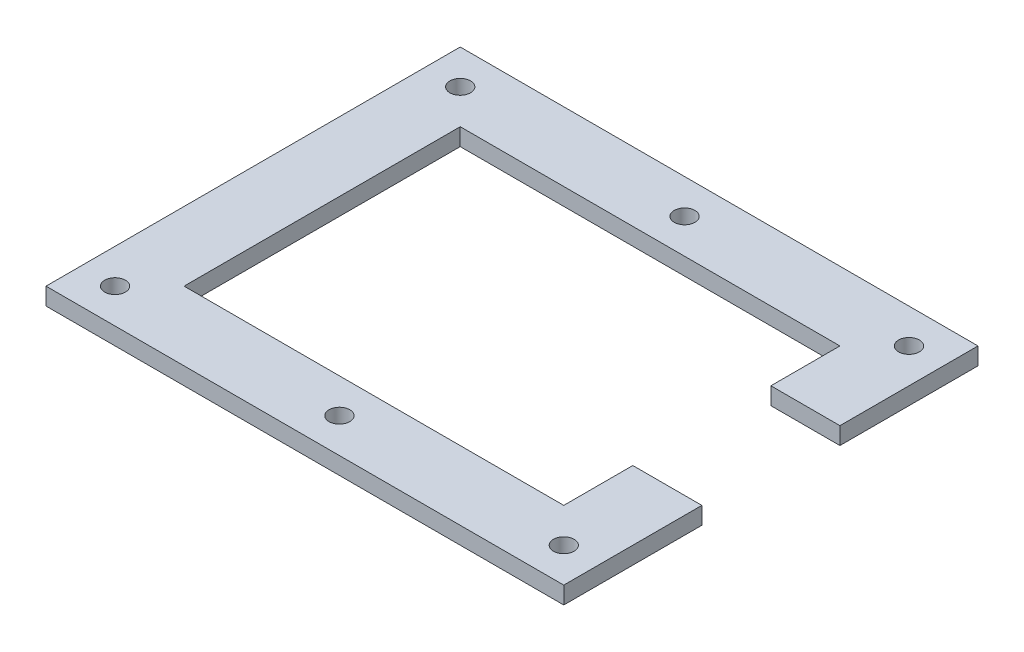
ISO-10303-21;
HEADER;
FILE_DESCRIPTION(('STEP AP214'),'2;1');
FILE_NAME('part.step','',(''),(''),'','','');
FILE_SCHEMA(('AUTOMOTIVE_DESIGN { 1 0 10303 214 1 1 1 1 }'));
ENDSEC;
DATA;
#1=APPLICATION_CONTEXT('core data for automotive mechanical design processes');
#2=APPLICATION_PROTOCOL_DEFINITION('international standard','automotive_design',2000,#1);
#3=PRODUCT_CONTEXT('',#1,'mechanical');
#4=PRODUCT('Part','Part','',(#3));
#5=PRODUCT_RELATED_PRODUCT_CATEGORY('part','',(#4));
#6=PRODUCT_DEFINITION_FORMATION('','',#4);
#7=PRODUCT_DEFINITION_CONTEXT('part definition',#1,'design');
#8=PRODUCT_DEFINITION('design','',#6,#7);
#9=PRODUCT_DEFINITION_SHAPE('','',#8);
#10=(LENGTH_UNIT() NAMED_UNIT(*) SI_UNIT(.MILLI.,.METRE.));
#11=(NAMED_UNIT(*) PLANE_ANGLE_UNIT() SI_UNIT($,.RADIAN.));
#12=(NAMED_UNIT(*) SI_UNIT($,.STERADIAN.) SOLID_ANGLE_UNIT());
#13=UNCERTAINTY_MEASURE_WITH_UNIT(LENGTH_MEASURE(1.E-05),#10,'distance_accuracy_value','');
#14=(GEOMETRIC_REPRESENTATION_CONTEXT(3) GLOBAL_UNCERTAINTY_ASSIGNED_CONTEXT((#13)) GLOBAL_UNIT_ASSIGNED_CONTEXT((#10,
#11,#12)) REPRESENTATION_CONTEXT('',''));
#15=CARTESIAN_POINT('',(0.,0.,0.));
#16=DIRECTION('',(0.,0.,1.));
#17=DIRECTION('',(1.,0.,0.));
#18=AXIS2_PLACEMENT_3D('',#15,#16,#17);
#19=CARTESIAN_POINT('',(75.,2.5,-30.));
#20=DIRECTION('',(-1.,0.,0.));
#21=DIRECTION('',(0.,0.,1.));
#22=AXIS2_PLACEMENT_3D('',#19,#20,#21);
#23=PLANE('',#22);
#24=DIRECTION('',(0.,0.,-1.));
#25=VECTOR('',#24,1.);
#26=CARTESIAN_POINT('',(75.,0.,-30.));
#27=LINE('',#26,#25);
#28=CARTESIAN_POINT('',(75.,0.,-10.));
#29=VERTEX_POINT('',#28);
#30=CARTESIAN_POINT('',(75.,0.,-30.));
#31=VERTEX_POINT('',#30);
#32=EDGE_CURVE('E154',#29,#31,#27,.T.);
#33=ORIENTED_EDGE('',*,*,#32,.T.);
#34=DIRECTION('',(0.,-1.,0.));
#35=VECTOR('',#34,1.);
#36=CARTESIAN_POINT('',(75.,2.5,-30.));
#37=LINE('',#36,#35);
#38=CARTESIAN_POINT('',(75.,2.5,-30.));
#39=VERTEX_POINT('',#38);
#40=EDGE_CURVE('E11',#39,#31,#37,.T.);
#41=ORIENTED_EDGE('',*,*,#40,.F.);
#42=DIRECTION('',(0.,0.,-1.));
#43=VECTOR('',#42,1.);
#44=CARTESIAN_POINT('',(75.,2.5,-30.));
#45=LINE('',#44,#43);
#46=CARTESIAN_POINT('',(75.,2.5,-10.));
#47=VERTEX_POINT('',#46);
#48=EDGE_CURVE('E177',#47,#39,#45,.T.);
#49=ORIENTED_EDGE('',*,*,#48,.F.);
#50=DIRECTION('',(0.,-1.,0.));
#51=VECTOR('',#50,1.);
#52=CARTESIAN_POINT('',(75.,2.5,-10.));
#53=LINE('',#52,#51);
#54=EDGE_CURVE('E150',#47,#29,#53,.T.);
#55=ORIENTED_EDGE('',*,*,#54,.T.);
#56=EDGE_LOOP('',(#33,#41,#49,#55));
#57=FACE_BOUND('',#56,.T.);
#58=ADVANCED_FACE('F34',(#57),#23,.F.);
#59=CARTESIAN_POINT('',(0.,2.5,-30.));
#60=DIRECTION('',(0.,0.,1.));
#61=DIRECTION('',(1.,0.,0.));
#62=AXIS2_PLACEMENT_3D('',#59,#60,#61);
#63=PLANE('',#62);
#64=DIRECTION('',(-1.,0.,0.));
#65=VECTOR('',#64,1.);
#66=CARTESIAN_POINT('',(0.,0.,-30.));
#67=LINE('',#66,#65);
#68=CARTESIAN_POINT('',(0.,0.,-30.));
#69=VERTEX_POINT('',#68);
#70=EDGE_CURVE('E157',#31,#69,#67,.T.);
#71=ORIENTED_EDGE('',*,*,#70,.T.);
#72=DIRECTION('',(0.,-1.,0.));
#73=VECTOR('',#72,1.);
#74=CARTESIAN_POINT('',(0.,2.5,-30.));
#75=LINE('',#74,#73);
#76=CARTESIAN_POINT('',(0.,2.5,-30.));
#77=VERTEX_POINT('',#76);
#78=EDGE_CURVE('E42',#77,#69,#75,.T.);
#79=ORIENTED_EDGE('',*,*,#78,.F.);
#80=DIRECTION('',(-1.,0.,0.));
#81=VECTOR('',#80,1.);
#82=CARTESIAN_POINT('',(0.,2.5,-30.));
#83=LINE('',#82,#81);
#84=EDGE_CURVE('E105',#39,#77,#83,.T.);
#85=ORIENTED_EDGE('',*,*,#84,.F.);
#86=ORIENTED_EDGE('',*,*,#40,.T.);
#87=EDGE_LOOP('',(#71,#79,#85,#86));
#88=FACE_BOUND('',#87,.T.);
#89=ADVANCED_FACE('F256',(#88),#63,.F.);
#90=CARTESIAN_POINT('',(0.,2.5,30.));
#91=DIRECTION('',(1.,0.,0.));
#92=DIRECTION('',(0.,0.,-1.));
#93=AXIS2_PLACEMENT_3D('',#90,#91,#92);
#94=PLANE('',#93);
#95=DIRECTION('',(0.,0.,1.));
#96=VECTOR('',#95,1.);
#97=CARTESIAN_POINT('',(0.,0.,30.));
#98=LINE('',#97,#96);
#99=CARTESIAN_POINT('',(0.,0.,30.));
#100=VERTEX_POINT('',#99);
#101=EDGE_CURVE('E160',#69,#100,#98,.T.);
#102=ORIENTED_EDGE('',*,*,#101,.T.);
#103=DIRECTION('',(0.,-1.,0.));
#104=VECTOR('',#103,1.);
#105=CARTESIAN_POINT('',(0.,2.5,30.));
#106=LINE('',#105,#104);
#107=CARTESIAN_POINT('',(0.,2.5,30.));
#108=VERTEX_POINT('',#107);
#109=EDGE_CURVE('E196',#108,#100,#106,.T.);
#110=ORIENTED_EDGE('',*,*,#109,.F.);
#111=DIRECTION('',(0.,0.,1.));
#112=VECTOR('',#111,1.);
#113=CARTESIAN_POINT('',(0.,2.5,30.));
#114=LINE('',#113,#112);
#115=EDGE_CURVE('E204',#77,#108,#114,.T.);
#116=ORIENTED_EDGE('',*,*,#115,.F.);
#117=ORIENTED_EDGE('',*,*,#78,.T.);
#118=EDGE_LOOP('',(#102,#110,#116,#117));
#119=FACE_BOUND('',#118,.T.);
#120=ADVANCED_FACE('F202',(#119),#94,.F.);
#121=CARTESIAN_POINT('',(75.,2.5,30.));
#122=DIRECTION('',(0.,0.,-1.));
#123=DIRECTION('',(-1.,0.,0.));
#124=AXIS2_PLACEMENT_3D('',#121,#122,#123);
#125=PLANE('',#124);
#126=DIRECTION('',(1.,0.,0.));
#127=VECTOR('',#126,1.);
#128=CARTESIAN_POINT('',(75.,0.,30.));
#129=LINE('',#128,#127);
#130=CARTESIAN_POINT('',(75.,0.,30.));
#131=VERTEX_POINT('',#130);
#132=EDGE_CURVE('E162',#100,#131,#129,.T.);
#133=ORIENTED_EDGE('',*,*,#132,.T.);
#134=DIRECTION('',(0.,-1.,0.));
#135=VECTOR('',#134,1.);
#136=CARTESIAN_POINT('',(75.,2.5,30.));
#137=LINE('',#136,#135);
#138=CARTESIAN_POINT('',(75.,2.5,30.));
#139=VERTEX_POINT('',#138);
#140=EDGE_CURVE('E193',#139,#131,#137,.T.);
#141=ORIENTED_EDGE('',*,*,#140,.F.);
#142=DIRECTION('',(1.,0.,0.));
#143=VECTOR('',#142,1.);
#144=CARTESIAN_POINT('',(75.,2.5,30.));
#145=LINE('',#144,#143);
#146=EDGE_CURVE('E222',#108,#139,#145,.T.);
#147=ORIENTED_EDGE('',*,*,#146,.F.);
#148=ORIENTED_EDGE('',*,*,#109,.T.);
#149=EDGE_LOOP('',(#133,#141,#147,#148));
#150=FACE_BOUND('',#149,.T.);
#151=ADVANCED_FACE('F213',(#150),#125,.F.);
#152=CARTESIAN_POINT('',(75.,2.5,9.99999999999999));
#153=DIRECTION('',(-1.,0.,0.));
#154=DIRECTION('',(0.,0.,1.));
#155=AXIS2_PLACEMENT_3D('',#152,#153,#154);
#156=PLANE('',#155);
#157=DIRECTION('',(0.,0.,-1.));
#158=VECTOR('',#157,1.);
#159=CARTESIAN_POINT('',(75.,0.,9.99999999999999));
#160=LINE('',#159,#158);
#161=CARTESIAN_POINT('',(75.,0.,9.99999999999999));
#162=VERTEX_POINT('',#161);
#163=EDGE_CURVE('E164',#131,#162,#160,.T.);
#164=ORIENTED_EDGE('',*,*,#163,.T.);
#165=DIRECTION('',(0.,-1.,0.));
#166=VECTOR('',#165,1.);
#167=CARTESIAN_POINT('',(75.,2.5,9.99999999999999));
#168=LINE('',#167,#166);
#169=CARTESIAN_POINT('',(75.,2.5,9.99999999999999));
#170=VERTEX_POINT('',#169);
#171=EDGE_CURVE('E190',#170,#162,#168,.T.);
#172=ORIENTED_EDGE('',*,*,#171,.F.);
#173=DIRECTION('',(0.,0.,-1.));
#174=VECTOR('',#173,1.);
#175=CARTESIAN_POINT('',(75.,2.5,9.99999999999999));
#176=LINE('',#175,#174);
#177=EDGE_CURVE('E219',#139,#170,#176,.T.);
#178=ORIENTED_EDGE('',*,*,#177,.F.);
#179=ORIENTED_EDGE('',*,*,#140,.T.);
#180=EDGE_LOOP('',(#164,#172,#178,#179));
#181=FACE_BOUND('',#180,.T.);
#182=ADVANCED_FACE('F217',(#181),#156,.F.);
#183=CARTESIAN_POINT('',(65.,2.5,10.));
#184=DIRECTION('',(0.,0.,1.));
#185=DIRECTION('',(1.,0.,0.));
#186=AXIS2_PLACEMENT_3D('',#183,#184,#185);
#187=PLANE('',#186);
#188=DIRECTION('',(-1.,0.,0.));
#189=VECTOR('',#188,1.);
#190=CARTESIAN_POINT('',(65.,0.,10.));
#191=LINE('',#190,#189);
#192=CARTESIAN_POINT('',(65.,0.,10.));
#193=VERTEX_POINT('',#192);
#194=EDGE_CURVE('E166',#162,#193,#191,.T.);
#195=ORIENTED_EDGE('',*,*,#194,.T.);
#196=DIRECTION('',(0.,-1.,0.));
#197=VECTOR('',#196,1.);
#198=CARTESIAN_POINT('',(65.,2.5,10.));
#199=LINE('',#198,#197);
#200=CARTESIAN_POINT('',(65.,2.5,10.));
#201=VERTEX_POINT('',#200);
#202=EDGE_CURVE('E187',#201,#193,#199,.T.);
#203=ORIENTED_EDGE('',*,*,#202,.F.);
#204=DIRECTION('',(-1.,0.,0.));
#205=VECTOR('',#204,1.);
#206=CARTESIAN_POINT('',(65.,2.5,10.));
#207=LINE('',#206,#205);
#208=EDGE_CURVE('E221',#170,#201,#207,.T.);
#209=ORIENTED_EDGE('',*,*,#208,.F.);
#210=ORIENTED_EDGE('',*,*,#171,.T.);
#211=EDGE_LOOP('',(#195,#203,#209,#210));
#212=FACE_BOUND('',#211,.T.);
#213=ADVANCED_FACE('F269',(#212),#187,.F.);
#214=CARTESIAN_POINT('',(65.,2.5,20.));
#215=DIRECTION('',(1.,0.,0.));
#216=DIRECTION('',(0.,0.,-1.));
#217=AXIS2_PLACEMENT_3D('',#214,#215,#216);
#218=PLANE('',#217);
#219=DIRECTION('',(0.,0.,1.));
#220=VECTOR('',#219,1.);
#221=CARTESIAN_POINT('',(65.,0.,20.));
#222=LINE('',#221,#220);
#223=CARTESIAN_POINT('',(65.,0.,20.));
#224=VERTEX_POINT('',#223);
#225=EDGE_CURVE('E168',#193,#224,#222,.T.);
#226=ORIENTED_EDGE('',*,*,#225,.T.);
#227=DIRECTION('',(0.,-1.,0.));
#228=VECTOR('',#227,1.);
#229=CARTESIAN_POINT('',(65.,2.5,20.));
#230=LINE('',#229,#228);
#231=CARTESIAN_POINT('',(65.,2.5,20.));
#232=VERTEX_POINT('',#231);
#233=EDGE_CURVE('E184',#232,#224,#230,.T.);
#234=ORIENTED_EDGE('',*,*,#233,.F.);
#235=DIRECTION('',(0.,0.,1.));
#236=VECTOR('',#235,1.);
#237=CARTESIAN_POINT('',(65.,2.5,20.));
#238=LINE('',#237,#236);
#239=EDGE_CURVE('E224',#201,#232,#238,.T.);
#240=ORIENTED_EDGE('',*,*,#239,.F.);
#241=ORIENTED_EDGE('',*,*,#202,.T.);
#242=EDGE_LOOP('',(#226,#234,#240,#241));
#243=FACE_BOUND('',#242,.T.);
#244=ADVANCED_FACE('F272',(#243),#218,.F.);
#245=CARTESIAN_POINT('',(10.,2.5,20.));
#246=DIRECTION('',(0.,0.,1.));
#247=DIRECTION('',(1.,0.,0.));
#248=AXIS2_PLACEMENT_3D('',#245,#246,#247);
#249=PLANE('',#248);
#250=DIRECTION('',(-1.,0.,0.));
#251=VECTOR('',#250,1.);
#252=CARTESIAN_POINT('',(10.,0.,20.));
#253=LINE('',#252,#251);
#254=CARTESIAN_POINT('',(10.,0.,20.));
#255=VERTEX_POINT('',#254);
#256=EDGE_CURVE('E170',#224,#255,#253,.T.);
#257=ORIENTED_EDGE('',*,*,#256,.T.);
#258=DIRECTION('',(0.,-1.,0.));
#259=VECTOR('',#258,1.);
#260=CARTESIAN_POINT('',(10.,2.5,20.));
#261=LINE('',#260,#259);
#262=CARTESIAN_POINT('',(10.,2.5,20.));
#263=VERTEX_POINT('',#262);
#264=EDGE_CURVE('E181',#263,#255,#261,.T.);
#265=ORIENTED_EDGE('',*,*,#264,.F.);
#266=DIRECTION('',(-1.,0.,0.));
#267=VECTOR('',#266,1.);
#268=CARTESIAN_POINT('',(10.,2.5,20.));
#269=LINE('',#268,#267);
#270=EDGE_CURVE('E230',#232,#263,#269,.T.);
#271=ORIENTED_EDGE('',*,*,#270,.F.);
#272=ORIENTED_EDGE('',*,*,#233,.T.);
#273=EDGE_LOOP('',(#257,#265,#271,#272));
#274=FACE_BOUND('',#273,.T.);
#275=ADVANCED_FACE('F236',(#274),#249,.F.);
#276=CARTESIAN_POINT('',(10.,2.5,-20.));
#277=DIRECTION('',(-1.,0.,0.));
#278=DIRECTION('',(0.,0.,1.));
#279=AXIS2_PLACEMENT_3D('',#276,#277,#278);
#280=PLANE('',#279);
#281=DIRECTION('',(0.,0.,-1.));
#282=VECTOR('',#281,1.);
#283=CARTESIAN_POINT('',(10.,0.,-20.));
#284=LINE('',#283,#282);
#285=CARTESIAN_POINT('',(10.,0.,-20.));
#286=VERTEX_POINT('',#285);
#287=EDGE_CURVE('E172',#255,#286,#284,.T.);
#288=ORIENTED_EDGE('',*,*,#287,.T.);
#289=DIRECTION('',(0.,-1.,0.));
#290=VECTOR('',#289,1.);
#291=CARTESIAN_POINT('',(10.,2.5,-20.));
#292=LINE('',#291,#290);
#293=CARTESIAN_POINT('',(10.,2.5,-20.));
#294=VERTEX_POINT('',#293);
#295=EDGE_CURVE('E145',#294,#286,#292,.T.);
#296=ORIENTED_EDGE('',*,*,#295,.F.);
#297=DIRECTION('',(0.,0.,-1.));
#298=VECTOR('',#297,1.);
#299=CARTESIAN_POINT('',(10.,2.5,-20.));
#300=LINE('',#299,#298);
#301=EDGE_CURVE('E136',#263,#294,#300,.T.);
#302=ORIENTED_EDGE('',*,*,#301,.F.);
#303=ORIENTED_EDGE('',*,*,#264,.T.);
#304=EDGE_LOOP('',(#288,#296,#302,#303));
#305=FACE_BOUND('',#304,.T.);
#306=ADVANCED_FACE('F240',(#305),#280,.F.);
#307=CARTESIAN_POINT('',(65.,2.5,-20.));
#308=DIRECTION('',(0.,0.,-1.));
#309=DIRECTION('',(-1.,0.,0.));
#310=AXIS2_PLACEMENT_3D('',#307,#308,#309);
#311=PLANE('',#310);
#312=DIRECTION('',(1.,0.,0.));
#313=VECTOR('',#312,1.);
#314=CARTESIAN_POINT('',(65.,0.,-20.));
#315=LINE('',#314,#313);
#316=CARTESIAN_POINT('',(65.,0.,-20.));
#317=VERTEX_POINT('',#316);
#318=EDGE_CURVE('E144',#286,#317,#315,.T.);
#319=ORIENTED_EDGE('',*,*,#318,.T.);
#320=DIRECTION('',(0.,-1.,0.));
#321=VECTOR('',#320,1.);
#322=CARTESIAN_POINT('',(65.,2.5,-20.));
#323=LINE('',#322,#321);
#324=CARTESIAN_POINT('',(65.,2.5,-20.));
#325=VERTEX_POINT('',#324);
#326=EDGE_CURVE('E141',#325,#317,#323,.T.);
#327=ORIENTED_EDGE('',*,*,#326,.F.);
#328=DIRECTION('',(1.,0.,0.));
#329=VECTOR('',#328,1.);
#330=CARTESIAN_POINT('',(65.,2.5,-20.));
#331=LINE('',#330,#329);
#332=EDGE_CURVE('E130',#294,#325,#331,.T.);
#333=ORIENTED_EDGE('',*,*,#332,.F.);
#334=ORIENTED_EDGE('',*,*,#295,.T.);
#335=EDGE_LOOP('',(#319,#327,#333,#334));
#336=FACE_BOUND('',#335,.T.);
#337=ADVANCED_FACE('F142',(#336),#311,.F.);
#338=CARTESIAN_POINT('',(65.,2.5,-10.));
#339=DIRECTION('',(1.,0.,0.));
#340=DIRECTION('',(0.,0.,-1.));
#341=AXIS2_PLACEMENT_3D('',#338,#339,#340);
#342=PLANE('',#341);
#343=DIRECTION('',(0.,0.,1.));
#344=VECTOR('',#343,1.);
#345=CARTESIAN_POINT('',(65.,0.,-10.));
#346=LINE('',#345,#344);
#347=CARTESIAN_POINT('',(65.,0.,-10.));
#348=VERTEX_POINT('',#347);
#349=EDGE_CURVE('E91',#317,#348,#346,.T.);
#350=ORIENTED_EDGE('',*,*,#349,.T.);
#351=DIRECTION('',(0.,-1.,0.));
#352=VECTOR('',#351,1.);
#353=CARTESIAN_POINT('',(65.,2.5,-10.));
#354=LINE('',#353,#352);
#355=CARTESIAN_POINT('',(65.,2.5,-10.));
#356=VERTEX_POINT('',#355);
#357=EDGE_CURVE('E146',#356,#348,#354,.T.);
#358=ORIENTED_EDGE('',*,*,#357,.F.);
#359=DIRECTION('',(0.,0.,1.));
#360=VECTOR('',#359,1.);
#361=CARTESIAN_POINT('',(65.,2.5,-10.));
#362=LINE('',#361,#360);
#363=EDGE_CURVE('E134',#325,#356,#362,.T.);
#364=ORIENTED_EDGE('',*,*,#363,.F.);
#365=ORIENTED_EDGE('',*,*,#326,.T.);
#366=EDGE_LOOP('',(#350,#358,#364,#365));
#367=FACE_BOUND('',#366,.T.);
#368=ADVANCED_FACE('F148',(#367),#342,.F.);
#369=CARTESIAN_POINT('',(75.,2.5,-10.));
#370=DIRECTION('',(0.,0.,-1.));
#371=DIRECTION('',(-1.,0.,0.));
#372=AXIS2_PLACEMENT_3D('',#369,#370,#371);
#373=PLANE('',#372);
#374=DIRECTION('',(1.,0.,0.));
#375=VECTOR('',#374,1.);
#376=CARTESIAN_POINT('',(75.,0.,-10.));
#377=LINE('',#376,#375);
#378=EDGE_CURVE('E97',#348,#29,#377,.T.);
#379=ORIENTED_EDGE('',*,*,#378,.T.);
#380=ORIENTED_EDGE('',*,*,#54,.F.);
#381=DIRECTION('',(1.,0.,0.));
#382=VECTOR('',#381,1.);
#383=CARTESIAN_POINT('',(75.,2.5,-10.));
#384=LINE('',#383,#382);
#385=EDGE_CURVE('E50',#356,#47,#384,.T.);
#386=ORIENTED_EDGE('',*,*,#385,.F.);
#387=ORIENTED_EDGE('',*,*,#357,.T.);
#388=EDGE_LOOP('',(#379,#380,#386,#387));
#389=FACE_BOUND('',#388,.T.);
#390=ADVANCED_FACE('F244',(#389),#373,.F.);
#391=CARTESIAN_POINT('',(0.,2.5,0.));
#392=DIRECTION('',(0.,-1.,0.));
#393=DIRECTION('',(0.,0.,-1.));
#394=AXIS2_PLACEMENT_3D('',#391,#392,#393);
#395=PLANE('',#394);
#396=CARTESIAN_POINT('',(70.,2.5,-25.));
#397=DIRECTION('',(0.,1.,0.));
#398=DIRECTION('',(0.,0.,-1.));
#399=AXIS2_PLACEMENT_3D('',#396,#397,#398);
#400=CIRCLE('',#399,1.5);
#401=CARTESIAN_POINT('',(70.,2.5,-26.5));
#402=VERTEX_POINT('',#401);
#403=EDGE_CURVE('E375',#402,#402,#400,.T.);
#404=ORIENTED_EDGE('',*,*,#403,.F.);
#405=EDGE_LOOP('',(#404));
#406=FACE_BOUND('',#405,.T.);
#407=CARTESIAN_POINT('',(70.,2.5,25.));
#408=DIRECTION('',(0.,1.,0.));
#409=DIRECTION('',(0.,0.,1.));
#410=AXIS2_PLACEMENT_3D('',#407,#408,#409);
#411=CIRCLE('',#410,1.5);
#412=CARTESIAN_POINT('',(70.,2.5,26.5));
#413=VERTEX_POINT('',#412);
#414=EDGE_CURVE('E379',#413,#413,#411,.T.);
#415=ORIENTED_EDGE('',*,*,#414,.F.);
#416=EDGE_LOOP('',(#415));
#417=FACE_BOUND('',#416,.T.);
#418=CARTESIAN_POINT('',(4.99999999999999,2.5,25.));
#419=DIRECTION('',(0.,1.,0.));
#420=DIRECTION('',(0.,0.,-1.));
#421=AXIS2_PLACEMENT_3D('',#418,#419,#420);
#422=CIRCLE('',#421,1.5);
#423=CARTESIAN_POINT('',(4.99999999999999,2.5,23.5));
#424=VERTEX_POINT('',#423);
#425=EDGE_CURVE('E390',#424,#424,#422,.T.);
#426=ORIENTED_EDGE('',*,*,#425,.F.);
#427=EDGE_LOOP('',(#426));
#428=FACE_BOUND('',#427,.T.);
#429=CARTESIAN_POINT('',(37.5,2.5,25.));
#430=DIRECTION('',(0.,1.,0.));
#431=DIRECTION('',(0.,0.,-1.));
#432=AXIS2_PLACEMENT_3D('',#429,#430,#431);
#433=CIRCLE('',#432,1.5);
#434=CARTESIAN_POINT('',(37.5,2.5,23.5));
#435=VERTEX_POINT('',#434);
#436=EDGE_CURVE('E396',#435,#435,#433,.T.);
#437=ORIENTED_EDGE('',*,*,#436,.F.);
#438=EDGE_LOOP('',(#437));
#439=FACE_BOUND('',#438,.T.);
#440=CARTESIAN_POINT('',(37.5,2.5,-25.));
#441=DIRECTION('',(0.,1.,0.));
#442=DIRECTION('',(0.,0.,1.));
#443=AXIS2_PLACEMENT_3D('',#440,#441,#442);
#444=CIRCLE('',#443,1.5);
#445=CARTESIAN_POINT('',(37.5,2.5,-23.5));
#446=VERTEX_POINT('',#445);
#447=EDGE_CURVE('E402',#446,#446,#444,.T.);
#448=ORIENTED_EDGE('',*,*,#447,.F.);
#449=EDGE_LOOP('',(#448));
#450=FACE_BOUND('',#449,.T.);
#451=CARTESIAN_POINT('',(4.99999999999999,2.5,-25.));
#452=DIRECTION('',(0.,1.,0.));
#453=DIRECTION('',(0.,0.,1.));
#454=AXIS2_PLACEMENT_3D('',#451,#452,#453);
#455=CIRCLE('',#454,1.5);
#456=CARTESIAN_POINT('',(4.99999999999999,2.5,-23.5));
#457=VERTEX_POINT('',#456);
#458=EDGE_CURVE('E158',#457,#457,#455,.T.);
#459=ORIENTED_EDGE('',*,*,#458,.F.);
#460=EDGE_LOOP('',(#459));
#461=FACE_BOUND('',#460,.T.);
#462=ORIENTED_EDGE('',*,*,#48,.T.);
#463=ORIENTED_EDGE('',*,*,#84,.T.);
#464=ORIENTED_EDGE('',*,*,#115,.T.);
#465=ORIENTED_EDGE('',*,*,#146,.T.);
#466=ORIENTED_EDGE('',*,*,#177,.T.);
#467=ORIENTED_EDGE('',*,*,#208,.T.);
#468=ORIENTED_EDGE('',*,*,#239,.T.);
#469=ORIENTED_EDGE('',*,*,#270,.T.);
#470=ORIENTED_EDGE('',*,*,#301,.T.);
#471=ORIENTED_EDGE('',*,*,#332,.T.);
#472=ORIENTED_EDGE('',*,*,#363,.T.);
#473=ORIENTED_EDGE('',*,*,#385,.T.);
#474=EDGE_LOOP('',(#462,#463,#464,#465,#466,#467,#468,#469,#470,#471,#472,#473));
#475=FACE_BOUND('',#474,.T.);
#476=ADVANCED_FACE('F132',(#406,#417,#428,#439,#450,#461,#475),#395,.F.);
#477=CARTESIAN_POINT('',(0.,0.,0.));
#478=DIRECTION('',(0.,-1.,0.));
#479=DIRECTION('',(0.,0.,-1.));
#480=AXIS2_PLACEMENT_3D('',#477,#478,#479);
#481=PLANE('',#480);
#482=CARTESIAN_POINT('',(70.,0.,-25.));
#483=DIRECTION('',(0.,1.,0.));
#484=DIRECTION('',(0.,0.,-1.));
#485=AXIS2_PLACEMENT_3D('',#482,#483,#484);
#486=CIRCLE('',#485,1.5);
#487=CARTESIAN_POINT('',(70.,0.,-26.5));
#488=VERTEX_POINT('',#487);
#489=EDGE_CURVE('E378',#488,#488,#486,.T.);
#490=ORIENTED_EDGE('',*,*,#489,.T.);
#491=EDGE_LOOP('',(#490));
#492=FACE_BOUND('',#491,.T.);
#493=CARTESIAN_POINT('',(70.,0.,25.));
#494=DIRECTION('',(0.,1.,0.));
#495=DIRECTION('',(0.,0.,1.));
#496=AXIS2_PLACEMENT_3D('',#493,#494,#495);
#497=CIRCLE('',#496,1.5);
#498=CARTESIAN_POINT('',(70.,0.,26.5));
#499=VERTEX_POINT('',#498);
#500=EDGE_CURVE('E384',#499,#499,#497,.T.);
#501=ORIENTED_EDGE('',*,*,#500,.T.);
#502=EDGE_LOOP('',(#501));
#503=FACE_BOUND('',#502,.T.);
#504=CARTESIAN_POINT('',(4.99999999999999,0.,25.));
#505=DIRECTION('',(0.,1.,0.));
#506=DIRECTION('',(0.,0.,-1.));
#507=AXIS2_PLACEMENT_3D('',#504,#505,#506);
#508=CIRCLE('',#507,1.5);
#509=CARTESIAN_POINT('',(4.99999999999999,0.,23.5));
#510=VERTEX_POINT('',#509);
#511=EDGE_CURVE('E393',#510,#510,#508,.T.);
#512=ORIENTED_EDGE('',*,*,#511,.T.);
#513=EDGE_LOOP('',(#512));
#514=FACE_BOUND('',#513,.T.);
#515=CARTESIAN_POINT('',(37.5,0.,25.));
#516=DIRECTION('',(0.,1.,0.));
#517=DIRECTION('',(0.,0.,-1.));
#518=AXIS2_PLACEMENT_3D('',#515,#516,#517);
#519=CIRCLE('',#518,1.5);
#520=CARTESIAN_POINT('',(37.5,0.,23.5));
#521=VERTEX_POINT('',#520);
#522=EDGE_CURVE('E399',#521,#521,#519,.T.);
#523=ORIENTED_EDGE('',*,*,#522,.T.);
#524=EDGE_LOOP('',(#523));
#525=FACE_BOUND('',#524,.T.);
#526=CARTESIAN_POINT('',(37.5,0.,-25.));
#527=DIRECTION('',(0.,1.,0.));
#528=DIRECTION('',(0.,0.,1.));
#529=AXIS2_PLACEMENT_3D('',#526,#527,#528);
#530=CIRCLE('',#529,1.5);
#531=CARTESIAN_POINT('',(37.5,0.,-23.5));
#532=VERTEX_POINT('',#531);
#533=EDGE_CURVE('E416',#532,#532,#530,.T.);
#534=ORIENTED_EDGE('',*,*,#533,.T.);
#535=EDGE_LOOP('',(#534));
#536=FACE_BOUND('',#535,.T.);
#537=CARTESIAN_POINT('',(4.99999999999999,0.,-25.));
#538=DIRECTION('',(0.,1.,0.));
#539=DIRECTION('',(0.,0.,1.));
#540=AXIS2_PLACEMENT_3D('',#537,#538,#539);
#541=CIRCLE('',#540,1.5);
#542=CARTESIAN_POINT('',(4.99999999999999,0.,-23.5));
#543=VERTEX_POINT('',#542);
#544=EDGE_CURVE('E381',#543,#543,#541,.T.);
#545=ORIENTED_EDGE('',*,*,#544,.T.);
#546=EDGE_LOOP('',(#545));
#547=FACE_BOUND('',#546,.T.);
#548=ORIENTED_EDGE('',*,*,#32,.F.);
#549=ORIENTED_EDGE('',*,*,#378,.F.);
#550=ORIENTED_EDGE('',*,*,#349,.F.);
#551=ORIENTED_EDGE('',*,*,#318,.F.);
#552=ORIENTED_EDGE('',*,*,#287,.F.);
#553=ORIENTED_EDGE('',*,*,#256,.F.);
#554=ORIENTED_EDGE('',*,*,#225,.F.);
#555=ORIENTED_EDGE('',*,*,#194,.F.);
#556=ORIENTED_EDGE('',*,*,#163,.F.);
#557=ORIENTED_EDGE('',*,*,#132,.F.);
#558=ORIENTED_EDGE('',*,*,#101,.F.);
#559=ORIENTED_EDGE('',*,*,#70,.F.);
#560=EDGE_LOOP('',(#548,#549,#550,#551,#552,#553,#554,#555,#556,#557,#558,#559));
#561=FACE_BOUND('',#560,.T.);
#562=ADVANCED_FACE('F208',(#492,#503,#514,#525,#536,#547,#561),#481,.T.);
#563=CARTESIAN_POINT('',(4.99999999999999,2.5,-25.));
#564=DIRECTION('',(0.,-1.,0.));
#565=DIRECTION('',(0.,0.,-1.));
#566=AXIS2_PLACEMENT_3D('',#563,#564,#565);
#567=CYLINDRICAL_SURFACE('',#566,1.5);
#568=ORIENTED_EDGE('',*,*,#458,.T.);
#569=EDGE_LOOP('',(#568));
#570=FACE_BOUND('',#569,.T.);
#571=ORIENTED_EDGE('',*,*,#544,.F.);
#572=EDGE_LOOP('',(#571));
#573=FACE_BOUND('',#572,.T.);
#574=ADVANCED_FACE('F309',(#570,#573),#567,.F.);
#575=CARTESIAN_POINT('',(37.5,2.5,-25.));
#576=DIRECTION('',(0.,-1.,0.));
#577=DIRECTION('',(0.,0.,-1.));
#578=AXIS2_PLACEMENT_3D('',#575,#576,#577);
#579=CYLINDRICAL_SURFACE('',#578,1.5);
#580=ORIENTED_EDGE('',*,*,#447,.T.);
#581=EDGE_LOOP('',(#580));
#582=FACE_BOUND('',#581,.T.);
#583=ORIENTED_EDGE('',*,*,#533,.F.);
#584=EDGE_LOOP('',(#583));
#585=FACE_BOUND('',#584,.T.);
#586=ADVANCED_FACE('F318',(#582,#585),#579,.F.);
#587=CARTESIAN_POINT('',(37.5,2.5,25.));
#588=DIRECTION('',(0.,-1.,0.));
#589=DIRECTION('',(0.,0.,-1.));
#590=AXIS2_PLACEMENT_3D('',#587,#588,#589);
#591=CYLINDRICAL_SURFACE('',#590,1.5);
#592=ORIENTED_EDGE('',*,*,#436,.T.);
#593=EDGE_LOOP('',(#592));
#594=FACE_BOUND('',#593,.T.);
#595=ORIENTED_EDGE('',*,*,#522,.F.);
#596=EDGE_LOOP('',(#595));
#597=FACE_BOUND('',#596,.T.);
#598=ADVANCED_FACE('F328',(#594,#597),#591,.F.);
#599=CARTESIAN_POINT('',(4.99999999999999,2.5,25.));
#600=DIRECTION('',(0.,-1.,0.));
#601=DIRECTION('',(0.,0.,-1.));
#602=AXIS2_PLACEMENT_3D('',#599,#600,#601);
#603=CYLINDRICAL_SURFACE('',#602,1.5);
#604=ORIENTED_EDGE('',*,*,#425,.T.);
#605=EDGE_LOOP('',(#604));
#606=FACE_BOUND('',#605,.T.);
#607=ORIENTED_EDGE('',*,*,#511,.F.);
#608=EDGE_LOOP('',(#607));
#609=FACE_BOUND('',#608,.T.);
#610=ADVANCED_FACE('F338',(#606,#609),#603,.F.);
#611=CARTESIAN_POINT('',(70.,2.5,25.));
#612=DIRECTION('',(0.,-1.,0.));
#613=DIRECTION('',(0.,0.,-1.));
#614=AXIS2_PLACEMENT_3D('',#611,#612,#613);
#615=CYLINDRICAL_SURFACE('',#614,1.5);
#616=ORIENTED_EDGE('',*,*,#414,.T.);
#617=EDGE_LOOP('',(#616));
#618=FACE_BOUND('',#617,.T.);
#619=ORIENTED_EDGE('',*,*,#500,.F.);
#620=EDGE_LOOP('',(#619));
#621=FACE_BOUND('',#620,.T.);
#622=ADVANCED_FACE('F348',(#618,#621),#615,.F.);
#623=CARTESIAN_POINT('',(70.,2.5,-25.));
#624=DIRECTION('',(0.,-1.,0.));
#625=DIRECTION('',(0.,0.,-1.));
#626=AXIS2_PLACEMENT_3D('',#623,#624,#625);
#627=CYLINDRICAL_SURFACE('',#626,1.5);
#628=ORIENTED_EDGE('',*,*,#403,.T.);
#629=EDGE_LOOP('',(#628));
#630=FACE_BOUND('',#629,.T.);
#631=ORIENTED_EDGE('',*,*,#489,.F.);
#632=EDGE_LOOP('',(#631));
#633=FACE_BOUND('',#632,.T.);
#634=ADVANCED_FACE('F358',(#630,#633),#627,.F.);
#635=CLOSED_SHELL('',(#58,#89,#120,#151,#182,#213,#244,#275,#306,#337,#368,#390,#476,#562,#574,
#586,#598,#610,#622,#634));
#636=MANIFOLD_SOLID_BREP('B2',#635);
#637=ADVANCED_BREP_SHAPE_REPRESENTATION('',(#18,#636),#14);
#638=SHAPE_DEFINITION_REPRESENTATION(#9,#637);
ENDSEC;
END-ISO-10303-21;
